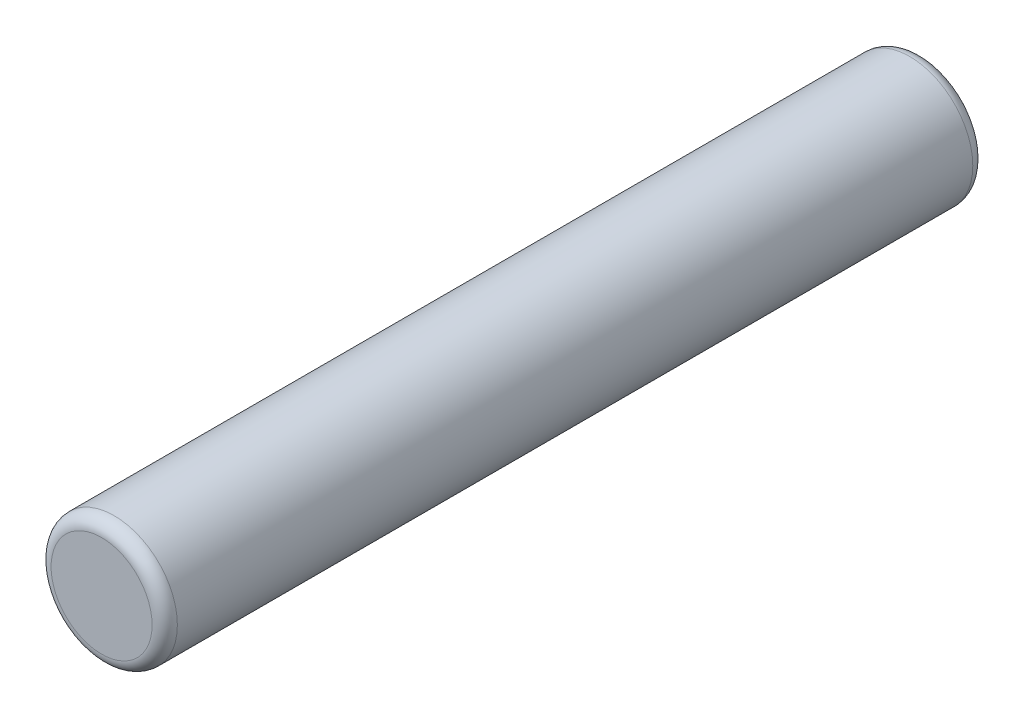
ISO-10303-21;
HEADER;
FILE_DESCRIPTION(('STEP AP214'),'2;1');
FILE_NAME('part.step','',(''),(''),'','','');
FILE_SCHEMA(('AUTOMOTIVE_DESIGN { 1 0 10303 214 1 1 1 1 }'));
ENDSEC;
DATA;
#1=APPLICATION_CONTEXT('core data for automotive mechanical design processes');
#2=APPLICATION_PROTOCOL_DEFINITION('international standard','automotive_design',2000,#1);
#3=PRODUCT_CONTEXT('',#1,'mechanical');
#4=PRODUCT('Part','Part','',(#3));
#5=PRODUCT_RELATED_PRODUCT_CATEGORY('part','',(#4));
#6=PRODUCT_DEFINITION_FORMATION('','',#4);
#7=PRODUCT_DEFINITION_CONTEXT('part definition',#1,'design');
#8=PRODUCT_DEFINITION('design','',#6,#7);
#9=PRODUCT_DEFINITION_SHAPE('','',#8);
#10=(LENGTH_UNIT() NAMED_UNIT(*) SI_UNIT(.MILLI.,.METRE.));
#11=(NAMED_UNIT(*) PLANE_ANGLE_UNIT() SI_UNIT($,.RADIAN.));
#12=(NAMED_UNIT(*) SI_UNIT($,.STERADIAN.) SOLID_ANGLE_UNIT());
#13=UNCERTAINTY_MEASURE_WITH_UNIT(LENGTH_MEASURE(1.E-05),#10,'distance_accuracy_value','');
#14=(GEOMETRIC_REPRESENTATION_CONTEXT(3) GLOBAL_UNCERTAINTY_ASSIGNED_CONTEXT((#13)) GLOBAL_UNIT_ASSIGNED_CONTEXT((#10,
#11,#12)) REPRESENTATION_CONTEXT('',''));
#15=CARTESIAN_POINT('',(0.,0.,0.));
#16=DIRECTION('',(0.,0.,1.));
#17=DIRECTION('',(1.,0.,0.));
#18=AXIS2_PLACEMENT_3D('',#15,#16,#17);
#19=CARTESIAN_POINT('',(0.,0.,130.));
#20=DIRECTION('',(0.,0.,-1.));
#21=DIRECTION('',(-1.,0.,0.));
#22=AXIS2_PLACEMENT_3D('',#19,#20,#21);
#23=CYLINDRICAL_SURFACE('',#22,10.);
#24=CARTESIAN_POINT('',(0.,0.,2.));
#25=DIRECTION('',(0.,0.,1.));
#26=DIRECTION('',(1.,0.,0.));
#27=AXIS2_PLACEMENT_3D('',#24,#25,#26);
#28=CIRCLE('',#27,10.);
#29=CARTESIAN_POINT('',(10.,0.,2.));
#30=VERTEX_POINT('',#29);
#31=EDGE_CURVE('E44',#30,#30,#28,.T.);
#32=ORIENTED_EDGE('',*,*,#31,.T.);
#33=EDGE_LOOP('',(#32));
#34=FACE_BOUND('',#33,.T.);
#35=CARTESIAN_POINT('',(0.,0.,128.));
#36=DIRECTION('',(0.,0.,1.));
#37=DIRECTION('',(1.,0.,0.));
#38=AXIS2_PLACEMENT_3D('',#35,#36,#37);
#39=CIRCLE('',#38,10.);
#40=CARTESIAN_POINT('',(10.,0.,128.));
#41=VERTEX_POINT('',#40);
#42=EDGE_CURVE('E48',#41,#41,#39,.F.);
#43=ORIENTED_EDGE('',*,*,#42,.T.);
#44=EDGE_LOOP('',(#43));
#45=FACE_BOUND('',#44,.T.);
#46=ADVANCED_FACE('F33',(#34,#45),#23,.T.);
#47=CARTESIAN_POINT('',(0.,0.,130.));
#48=DIRECTION('',(0.,0.,1.));
#49=DIRECTION('',(1.,0.,0.));
#50=AXIS2_PLACEMENT_3D('',#47,#48,#49);
#51=PLANE('',#50);
#52=CARTESIAN_POINT('',(0.,0.,130.));
#53=DIRECTION('',(0.,0.,1.));
#54=DIRECTION('',(1.,0.,0.));
#55=AXIS2_PLACEMENT_3D('',#52,#53,#54);
#56=CIRCLE('',#55,8.);
#57=CARTESIAN_POINT('',(8.,0.,130.));
#58=VERTEX_POINT('',#57);
#59=EDGE_CURVE('E10',#58,#58,#56,.T.);
#60=ORIENTED_EDGE('',*,*,#59,.T.);
#61=EDGE_LOOP('',(#60));
#62=FACE_BOUND('',#61,.T.);
#63=ADVANCED_FACE('F64',(#62),#51,.T.);
#64=CARTESIAN_POINT('',(0.,0.,0.));
#65=DIRECTION('',(0.,0.,1.));
#66=DIRECTION('',(1.,0.,0.));
#67=AXIS2_PLACEMENT_3D('',#64,#65,#66);
#68=PLANE('',#67);
#69=CARTESIAN_POINT('',(0.,0.,0.));
#70=DIRECTION('',(0.,0.,1.));
#71=DIRECTION('',(1.,0.,0.));
#72=AXIS2_PLACEMENT_3D('',#69,#70,#71);
#73=CIRCLE('',#72,8.);
#74=CARTESIAN_POINT('',(8.,0.,0.));
#75=VERTEX_POINT('',#74);
#76=EDGE_CURVE('E40',#75,#75,#73,.F.);
#77=ORIENTED_EDGE('',*,*,#76,.T.);
#78=EDGE_LOOP('',(#77));
#79=FACE_BOUND('',#78,.T.);
#80=ADVANCED_FACE('F61',(#79),#68,.F.);
#81=CARTESIAN_POINT('',(0.,0.,2.));
#82=DIRECTION('',(0.,0.,1.));
#83=DIRECTION('',(1.,0.,0.));
#84=AXIS2_PLACEMENT_3D('',#81,#82,#83);
#85=TOROIDAL_SURFACE('',#84,8.,2.);
#86=ORIENTED_EDGE('',*,*,#76,.F.);
#87=EDGE_LOOP('',(#86));
#88=FACE_BOUND('',#87,.T.);
#89=ORIENTED_EDGE('',*,*,#31,.F.);
#90=EDGE_LOOP('',(#89));
#91=FACE_BOUND('',#90,.T.);
#92=ADVANCED_FACE('F57',(#88,#91),#85,.T.);
#93=CARTESIAN_POINT('',(0.,0.,128.));
#94=DIRECTION('',(0.,0.,1.));
#95=DIRECTION('',(1.,0.,0.));
#96=AXIS2_PLACEMENT_3D('',#93,#94,#95);
#97=TOROIDAL_SURFACE('',#96,8.,2.);
#98=ORIENTED_EDGE('',*,*,#42,.F.);
#99=EDGE_LOOP('',(#98));
#100=FACE_BOUND('',#99,.T.);
#101=ORIENTED_EDGE('',*,*,#59,.F.);
#102=EDGE_LOOP('',(#101));
#103=FACE_BOUND('',#102,.T.);
#104=ADVANCED_FACE('F35',(#100,#103),#97,.T.);
#105=CLOSED_SHELL('',(#46,#63,#80,#92,#104));
#106=MANIFOLD_SOLID_BREP('B2',#105);
#107=ADVANCED_BREP_SHAPE_REPRESENTATION('',(#18,#106),#14);
#108=SHAPE_DEFINITION_REPRESENTATION(#9,#107);
ENDSEC;
END-ISO-10303-21;
